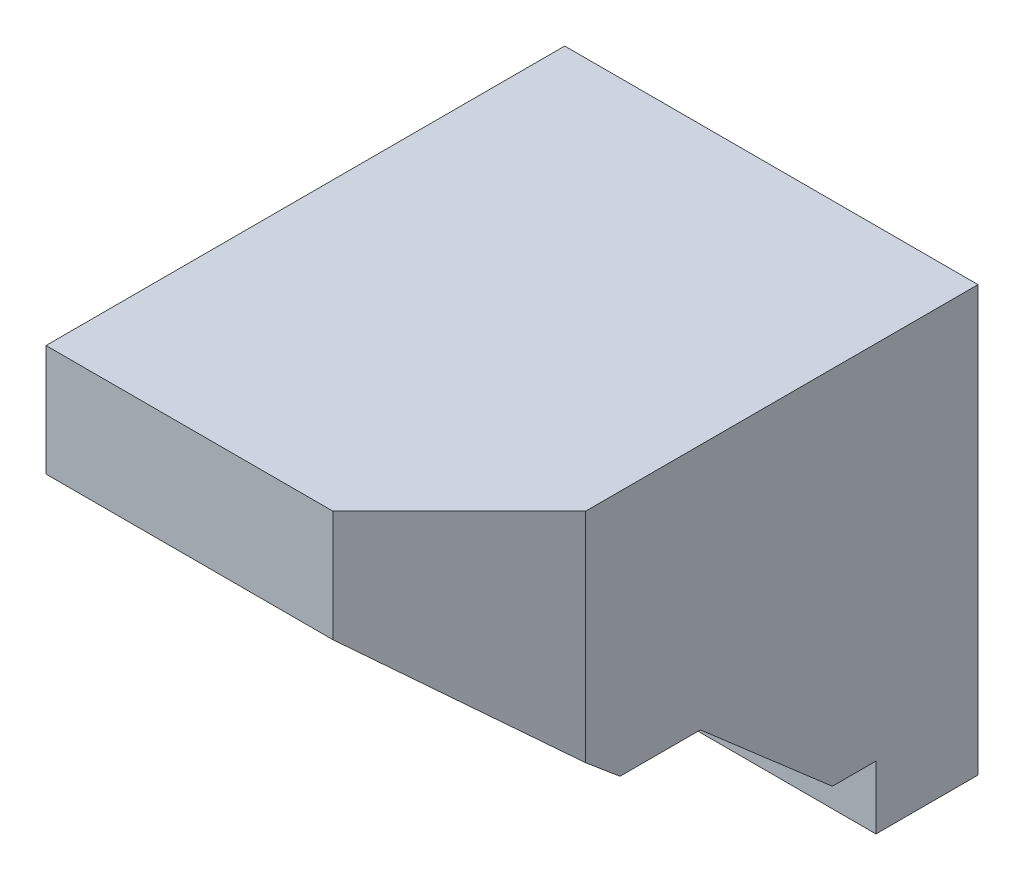
ISO-10303-21;
HEADER;
FILE_DESCRIPTION(('STEP AP214'),'2;1');
FILE_NAME('part.step','',(''),(''),'','','');
FILE_SCHEMA(('AUTOMOTIVE_DESIGN { 1 0 10303 214 1 1 1 1 }'));
ENDSEC;
DATA;
#1=APPLICATION_CONTEXT('core data for automotive mechanical design processes');
#2=APPLICATION_PROTOCOL_DEFINITION('international standard','automotive_design',2000,#1);
#3=PRODUCT_CONTEXT('',#1,'mechanical');
#4=PRODUCT('Part','Part','',(#3));
#5=PRODUCT_RELATED_PRODUCT_CATEGORY('part','',(#4));
#6=PRODUCT_DEFINITION_FORMATION('','',#4);
#7=PRODUCT_DEFINITION_CONTEXT('part definition',#1,'design');
#8=PRODUCT_DEFINITION('design','',#6,#7);
#9=PRODUCT_DEFINITION_SHAPE('','',#8);
#10=(LENGTH_UNIT() NAMED_UNIT(*) SI_UNIT(.MILLI.,.METRE.));
#11=(NAMED_UNIT(*) PLANE_ANGLE_UNIT() SI_UNIT($,.RADIAN.));
#12=(NAMED_UNIT(*) SI_UNIT($,.STERADIAN.) SOLID_ANGLE_UNIT());
#13=UNCERTAINTY_MEASURE_WITH_UNIT(LENGTH_MEASURE(1.E-05),#10,'distance_accuracy_value','');
#14=(GEOMETRIC_REPRESENTATION_CONTEXT(3) GLOBAL_UNCERTAINTY_ASSIGNED_CONTEXT((#13)) GLOBAL_UNIT_ASSIGNED_CONTEXT((#10,
#11,#12)) REPRESENTATION_CONTEXT('',''));
#15=CARTESIAN_POINT('',(0.,0.,0.));
#16=DIRECTION('',(0.,0.,1.));
#17=DIRECTION('',(1.,0.,0.));
#18=AXIS2_PLACEMENT_3D('',#15,#16,#17);
#19=CARTESIAN_POINT('',(180.,-292.,-311.875471025417));
#20=DIRECTION('',(0.,0.,-1.));
#21=DIRECTION('',(0.,1.,0.));
#22=AXIS2_PLACEMENT_3D('',#19,#20,#21);
#23=PLANE('',#22);
#24=DIRECTION('',(0.,1.,0.));
#25=VECTOR('',#24,1.);
#26=CARTESIAN_POINT('',(-180.,-199.5,-311.875471025417));
#27=LINE('',#26,#25);
#28=CARTESIAN_POINT('',(-179.999999999992,-477.,-311.875471025416));
#29=VERTEX_POINT('',#28);
#30=CARTESIAN_POINT('',(-179.999999999992,-107.,-311.875471025418));
#31=VERTEX_POINT('',#30);
#32=EDGE_CURVE('E11',#29,#31,#27,.T.);
#33=ORIENTED_EDGE('',*,*,#32,.T.);
#34=DIRECTION('',(-1.,0.,0.));
#35=VECTOR('',#34,1.);
#36=CARTESIAN_POINT('',(180.,-107.,-311.875471025418));
#37=LINE('',#36,#35);
#38=CARTESIAN_POINT('',(180.,-107.,-311.875471025418));
#39=VERTEX_POINT('',#38);
#40=EDGE_CURVE('E37',#39,#31,#37,.T.);
#41=ORIENTED_EDGE('',*,*,#40,.F.);
#42=DIRECTION('',(0.,-1.,0.));
#43=VECTOR('',#42,1.);
#44=CARTESIAN_POINT('',(180.,-107.,-311.875471025418));
#45=LINE('',#44,#43);
#46=CARTESIAN_POINT('',(180.,-477.,-311.875471025416));
#47=VERTEX_POINT('',#46);
#48=EDGE_CURVE('E28',#39,#47,#45,.T.);
#49=ORIENTED_EDGE('',*,*,#48,.T.);
#50=DIRECTION('',(-1.,0.,0.));
#51=VECTOR('',#50,1.);
#52=CARTESIAN_POINT('',(180.,-477.,-311.875471025416));
#53=LINE('',#52,#51);
#54=EDGE_CURVE('E155',#47,#29,#53,.T.);
#55=ORIENTED_EDGE('',*,*,#54,.T.);
#56=EDGE_LOOP('',(#33,#41,#49,#55));
#57=FACE_BOUND('',#56,.T.);
#58=ADVANCED_FACE('F17',(#57),#23,.T.);
#59=CARTESIAN_POINT('',(-180.,-422.,-204.000000000054));
#60=DIRECTION('',(0.,-1.,0.));
#61=DIRECTION('',(1.,0.,0.));
#62=AXIS2_PLACEMENT_3D('',#59,#60,#61);
#63=PLANE('',#62);
#64=DIRECTION('',(0.,0.,1.));
#65=VECTOR('',#64,1.);
#66=CARTESIAN_POINT('',(180.,-422.,-157.000000000026));
#67=LINE('',#66,#65);
#68=CARTESIAN_POINT('',(180.,-422.,-223.00000000006));
#69=VERTEX_POINT('',#68);
#70=CARTESIAN_POINT('',(180.,-422.,-185.000000000049));
#71=VERTEX_POINT('',#70);
#72=EDGE_CURVE('E159',#69,#71,#67,.T.);
#73=ORIENTED_EDGE('',*,*,#72,.T.);
#74=DIRECTION('',(-1.,0.,0.));
#75=VECTOR('',#74,1.);
#76=CARTESIAN_POINT('',(-180.,-422.,-185.000000000049));
#77=LINE('',#76,#75);
#78=CARTESIAN_POINT('',(-180.,-422.,-185.000000000049));
#79=VERTEX_POINT('',#78);
#80=EDGE_CURVE('E163',#71,#79,#77,.T.);
#81=ORIENTED_EDGE('',*,*,#80,.T.);
#82=DIRECTION('',(0.,0.,-1.));
#83=VECTOR('',#82,1.);
#84=CARTESIAN_POINT('',(-180.,-422.,-185.000000000049));
#85=LINE('',#84,#83);
#86=CARTESIAN_POINT('',(-180.,-422.,-223.00000000006));
#87=VERTEX_POINT('',#86);
#88=EDGE_CURVE('E167',#79,#87,#85,.T.);
#89=ORIENTED_EDGE('',*,*,#88,.T.);
#90=DIRECTION('',(-1.,0.,0.));
#91=VECTOR('',#90,1.);
#92=CARTESIAN_POINT('',(-180.,-422.,-223.00000000006));
#93=LINE('',#92,#91);
#94=EDGE_CURVE('E172',#69,#87,#93,.T.);
#95=ORIENTED_EDGE('',*,*,#94,.F.);
#96=EDGE_LOOP('',(#73,#81,#89,#95));
#97=FACE_BOUND('',#96,.T.);
#98=ADVANCED_FACE('F232',(#97),#63,.T.);
#99=CARTESIAN_POINT('',(-180.,-372.,-127.500000000049));
#100=DIRECTION('',(0.,-0.754605522163503,0.656178714924789));
#101=DIRECTION('',(1.,0.,0.));
#102=AXIS2_PLACEMENT_3D('',#99,#100,#101);
#103=PLANE('',#102);
#104=DIRECTION('',(0.,0.656178714924789,0.754605522163503));
#105=VECTOR('',#104,1.);
#106=CARTESIAN_POINT('',(180.,-310.616792249719,-56.9093110872253));
#107=LINE('',#106,#105);
#108=CARTESIAN_POINT('',(180.,-322.,-70.000000000049));
#109=VERTEX_POINT('',#108);
#110=EDGE_CURVE('E171',#71,#109,#107,.T.);
#111=ORIENTED_EDGE('',*,*,#110,.T.);
#112=DIRECTION('',(-1.,0.,0.));
#113=VECTOR('',#112,1.);
#114=CARTESIAN_POINT('',(-180.,-322.,-70.000000000049));
#115=LINE('',#114,#113);
#116=CARTESIAN_POINT('',(-180.,-322.,-70.0000000000489));
#117=VERTEX_POINT('',#116);
#118=EDGE_CURVE('E179',#109,#117,#115,.T.);
#119=ORIENTED_EDGE('',*,*,#118,.T.);
#120=DIRECTION('',(0.,-0.656178714924789,-0.754605522163503));
#121=VECTOR('',#120,1.);
#122=CARTESIAN_POINT('',(-180.,-322.,-70.0000000000489));
#123=LINE('',#122,#121);
#124=EDGE_CURVE('E183',#117,#79,#123,.T.);
#125=ORIENTED_EDGE('',*,*,#124,.T.);
#126=ORIENTED_EDGE('',*,*,#80,.F.);
#127=EDGE_LOOP('',(#111,#119,#125,#126));
#128=FACE_BOUND('',#127,.T.);
#129=ADVANCED_FACE('F234',(#128),#103,.T.);
#130=CARTESIAN_POINT('',(-180.,-322.,-35.0000000000239));
#131=DIRECTION('',(0.,-1.,0.));
#132=DIRECTION('',(1.,0.,0.));
#133=AXIS2_PLACEMENT_3D('',#130,#131,#132);
#134=PLANE('',#133);
#135=DIRECTION('',(0.,0.,1.));
#136=VECTOR('',#135,1.);
#137=CARTESIAN_POINT('',(180.,-322.,-72.5000000000114));
#138=LINE('',#137,#136);
#139=CARTESIAN_POINT('',(180.,-322.,1.0547118733939E-12));
#140=VERTEX_POINT('',#139);
#141=EDGE_CURVE('E187',#109,#140,#138,.T.);
#142=ORIENTED_EDGE('',*,*,#141,.T.);
#143=DIRECTION('',(-1.,0.,0.));
#144=VECTOR('',#143,1.);
#145=CARTESIAN_POINT('',(-180.,-322.,1.0547118733939E-12));
#146=LINE('',#145,#144);
#147=CARTESIAN_POINT('',(-180.,-322.,1.08246744900953E-12));
#148=VERTEX_POINT('',#147);
#149=EDGE_CURVE('E191',#140,#148,#146,.T.);
#150=ORIENTED_EDGE('',*,*,#149,.T.);
#151=DIRECTION('',(0.,0.,-1.));
#152=VECTOR('',#151,1.);
#153=CARTESIAN_POINT('',(-180.,-322.,1.08246744900953E-12));
#154=LINE('',#153,#152);
#155=EDGE_CURVE('E195',#148,#117,#154,.T.);
#156=ORIENTED_EDGE('',*,*,#155,.T.);
#157=ORIENTED_EDGE('',*,*,#118,.F.);
#158=EDGE_LOOP('',(#142,#150,#156,#157));
#159=FACE_BOUND('',#158,.T.);
#160=ADVANCED_FACE('F236',(#159),#134,.T.);
#161=CARTESIAN_POINT('',(-180.,-263.,70.0000000000009));
#162=DIRECTION('',(0.,-0.764627863081976,0.644472056026241));
#163=DIRECTION('',(1.,0.,0.));
#164=AXIS2_PLACEMENT_3D('',#161,#162,#163);
#165=PLANE('',#164);
#166=DIRECTION('',(-0.60741099872854,0.511960698928343,0.607410998728538));
#167=VECTOR('',#166,1.);
#168=CARTESIAN_POINT('',(51.1783751223552,-188.136059031699,158.821624877645));
#169=LINE('',#168,#167);
#170=CARTESIAN_POINT('',(180.,-296.714285714286,30.000000000001));
#171=VERTEX_POINT('',#170);
#172=CARTESIAN_POINT('',(70.,-204.,140.));
#173=VERTEX_POINT('',#172);
#174=EDGE_CURVE('E114',#171,#173,#169,.T.);
#175=ORIENTED_EDGE('',*,*,#174,.T.);
#176=DIRECTION('',(-1.,0.,0.));
#177=VECTOR('',#176,1.);
#178=CARTESIAN_POINT('',(-117.5,-204.,140.));
#179=LINE('',#178,#177);
#180=CARTESIAN_POINT('',(-180.,-204.,140.));
#181=VERTEX_POINT('',#180);
#182=EDGE_CURVE('E201',#173,#181,#179,.T.);
#183=ORIENTED_EDGE('',*,*,#182,.T.);
#184=DIRECTION('',(0.,-0.644472056026241,-0.764627863081976));
#185=VECTOR('',#184,1.);
#186=CARTESIAN_POINT('',(-180.,-204.,140.));
#187=LINE('',#186,#185);
#188=EDGE_CURVE('E205',#181,#148,#187,.T.);
#189=ORIENTED_EDGE('',*,*,#188,.T.);
#190=ORIENTED_EDGE('',*,*,#149,.F.);
#191=DIRECTION('',(0.,0.644472056026241,0.764627863081976));
#192=VECTOR('',#191,1.);
#193=CARTESIAN_POINT('',(180.,-274.953466173488,55.8179214890834));
#194=LINE('',#193,#192);
#195=EDGE_CURVE('E209',#140,#171,#194,.T.);
#196=ORIENTED_EDGE('',*,*,#195,.T.);
#197=EDGE_LOOP('',(#175,#183,#189,#190,#196));
#198=FACE_BOUND('',#197,.T.);
#199=ADVANCED_FACE('F238',(#198),#165,.T.);
#200=CARTESIAN_POINT('',(-180.,-449.5,-223.000000000059));
#201=DIRECTION('',(0.,0.,1.));
#202=DIRECTION('',(-1.,0.,0.));
#203=AXIS2_PLACEMENT_3D('',#200,#201,#202);
#204=PLANE('',#203);
#205=DIRECTION('',(0.,1.,0.));
#206=VECTOR('',#205,1.);
#207=CARTESIAN_POINT('',(180.,-278.25,-223.00000000006));
#208=LINE('',#207,#206);
#209=CARTESIAN_POINT('',(180.,-477.,-223.000000000059));
#210=VERTEX_POINT('',#209);
#211=EDGE_CURVE('E175',#210,#69,#208,.T.);
#212=ORIENTED_EDGE('',*,*,#211,.T.);
#213=ORIENTED_EDGE('',*,*,#94,.T.);
#214=DIRECTION('',(0.,-1.,0.));
#215=VECTOR('',#214,1.);
#216=CARTESIAN_POINT('',(-180.,-422.,-223.00000000006));
#217=LINE('',#216,#215);
#218=CARTESIAN_POINT('',(-180.,-477.,-223.000000000059));
#219=VERTEX_POINT('',#218);
#220=EDGE_CURVE('E136',#87,#219,#217,.T.);
#221=ORIENTED_EDGE('',*,*,#220,.T.);
#222=DIRECTION('',(-1.,0.,0.));
#223=VECTOR('',#222,1.);
#224=CARTESIAN_POINT('',(-90.,-477.,-223.000000000059));
#225=LINE('',#224,#223);
#226=EDGE_CURVE('E128',#210,#219,#225,.T.);
#227=ORIENTED_EDGE('',*,*,#226,.F.);
#228=EDGE_LOOP('',(#212,#213,#221,#227));
#229=FACE_BOUND('',#228,.T.);
#230=ADVANCED_FACE('F220',(#229),#204,.T.);
#231=CARTESIAN_POINT('',(-55.,-107.,140.));
#232=DIRECTION('',(0.,0.,1.));
#233=DIRECTION('',(-1.,0.,0.));
#234=AXIS2_PLACEMENT_3D('',#231,#232,#233);
#235=PLANE('',#234);
#236=ORIENTED_EDGE('',*,*,#182,.F.);
#237=DIRECTION('',(0.,-1.,0.));
#238=VECTOR('',#237,1.);
#239=CARTESIAN_POINT('',(70.,-107.,140.));
#240=LINE('',#239,#238);
#241=CARTESIAN_POINT('',(70.,-107.,140.));
#242=VERTEX_POINT('',#241);
#243=EDGE_CURVE('E117',#242,#173,#240,.T.);
#244=ORIENTED_EDGE('',*,*,#243,.F.);
#245=DIRECTION('',(1.,0.,0.));
#246=VECTOR('',#245,1.);
#247=CARTESIAN_POINT('',(-180.,-107.,140.));
#248=LINE('',#247,#246);
#249=CARTESIAN_POINT('',(-180.,-107.,140.));
#250=VERTEX_POINT('',#249);
#251=EDGE_CURVE('E91',#250,#242,#248,.T.);
#252=ORIENTED_EDGE('',*,*,#251,.F.);
#253=DIRECTION('',(0.,-1.,0.));
#254=VECTOR('',#253,1.);
#255=CARTESIAN_POINT('',(-180.,-107.,140.));
#256=LINE('',#255,#254);
#257=EDGE_CURVE('E133',#250,#181,#256,.T.);
#258=ORIENTED_EDGE('',*,*,#257,.T.);
#259=EDGE_LOOP('',(#236,#244,#252,#258));
#260=FACE_BOUND('',#259,.T.);
#261=ADVANCED_FACE('F239',(#260),#235,.T.);
#262=CARTESIAN_POINT('',(0.,-477.,1.66422298576545E-12));
#263=DIRECTION('',(0.,-1.,0.));
#264=DIRECTION('',(1.,0.,0.));
#265=AXIS2_PLACEMENT_3D('',#262,#263,#264);
#266=PLANE('',#265);
#267=DIRECTION('',(0.,0.,1.));
#268=VECTOR('',#267,1.);
#269=CARTESIAN_POINT('',(180.,-477.,-311.875471025416));
#270=LINE('',#269,#268);
#271=EDGE_CURVE('E137',#47,#210,#270,.T.);
#272=ORIENTED_EDGE('',*,*,#271,.T.);
#273=ORIENTED_EDGE('',*,*,#226,.T.);
#274=DIRECTION('',(0.,0.,1.));
#275=VECTOR('',#274,1.);
#276=CARTESIAN_POINT('',(-180.,-477.,-250.));
#277=LINE('',#276,#275);
#278=EDGE_CURVE('E116',#29,#219,#277,.T.);
#279=ORIENTED_EDGE('',*,*,#278,.F.);
#280=ORIENTED_EDGE('',*,*,#54,.F.);
#281=EDGE_LOOP('',(#272,#273,#279,#280));
#282=FACE_BOUND('',#281,.T.);
#283=ADVANCED_FACE('F227',(#282),#266,.T.);
#284=CARTESIAN_POINT('',(-180.,-107.,-55.));
#285=DIRECTION('',(-1.,0.,0.));
#286=DIRECTION('',(0.,0.,-1.));
#287=AXIS2_PLACEMENT_3D('',#284,#285,#286);
#288=PLANE('',#287);
#289=ORIENTED_EDGE('',*,*,#220,.F.);
#290=ORIENTED_EDGE('',*,*,#88,.F.);
#291=ORIENTED_EDGE('',*,*,#124,.F.);
#292=ORIENTED_EDGE('',*,*,#155,.F.);
#293=ORIENTED_EDGE('',*,*,#188,.F.);
#294=ORIENTED_EDGE('',*,*,#257,.F.);
#295=DIRECTION('',(0.,0.,1.));
#296=VECTOR('',#295,1.);
#297=CARTESIAN_POINT('',(-180.,-107.,-250.));
#298=LINE('',#297,#296);
#299=EDGE_CURVE('E132',#31,#250,#298,.T.);
#300=ORIENTED_EDGE('',*,*,#299,.F.);
#301=ORIENTED_EDGE('',*,*,#32,.F.);
#302=ORIENTED_EDGE('',*,*,#278,.T.);
#303=EDGE_LOOP('',(#289,#290,#291,#292,#293,#294,#300,#301,#302));
#304=FACE_BOUND('',#303,.T.);
#305=ADVANCED_FACE('F225',(#304),#288,.T.);
#306=CARTESIAN_POINT('',(180.,-107.,-110.));
#307=DIRECTION('',(1.,0.,0.));
#308=DIRECTION('',(0.,-1.,0.));
#309=AXIS2_PLACEMENT_3D('',#306,#307,#308);
#310=PLANE('',#309);
#311=ORIENTED_EDGE('',*,*,#72,.F.);
#312=ORIENTED_EDGE('',*,*,#211,.F.);
#313=ORIENTED_EDGE('',*,*,#271,.F.);
#314=ORIENTED_EDGE('',*,*,#48,.F.);
#315=DIRECTION('',(0.,0.,-1.));
#316=VECTOR('',#315,1.);
#317=CARTESIAN_POINT('',(180.,-107.,-250.));
#318=LINE('',#317,#316);
#319=CARTESIAN_POINT('',(180.,-107.,30.));
#320=VERTEX_POINT('',#319);
#321=EDGE_CURVE('E97',#320,#39,#318,.T.);
#322=ORIENTED_EDGE('',*,*,#321,.F.);
#323=DIRECTION('',(0.,-1.,0.));
#324=VECTOR('',#323,1.);
#325=CARTESIAN_POINT('',(180.,-107.,30.));
#326=LINE('',#325,#324);
#327=EDGE_CURVE('E102',#320,#171,#326,.T.);
#328=ORIENTED_EDGE('',*,*,#327,.T.);
#329=ORIENTED_EDGE('',*,*,#195,.F.);
#330=ORIENTED_EDGE('',*,*,#141,.F.);
#331=ORIENTED_EDGE('',*,*,#110,.F.);
#332=EDGE_LOOP('',(#311,#312,#313,#314,#322,#328,#329,#330,#331));
#333=FACE_BOUND('',#332,.T.);
#334=ADVANCED_FACE('F100',(#333),#310,.T.);
#335=CARTESIAN_POINT('',(125.,-107.,85.));
#336=DIRECTION('',(0.707106781186548,0.,0.707106781186547));
#337=DIRECTION('',(0.,1.,0.));
#338=AXIS2_PLACEMENT_3D('',#335,#336,#337);
#339=PLANE('',#338);
#340=ORIENTED_EDGE('',*,*,#174,.F.);
#341=ORIENTED_EDGE('',*,*,#327,.F.);
#342=DIRECTION('',(0.707106781186547,0.,-0.707106781186548));
#343=VECTOR('',#342,1.);
#344=CARTESIAN_POINT('',(70.,-107.,140.));
#345=LINE('',#344,#343);
#346=EDGE_CURVE('E21',#242,#320,#345,.T.);
#347=ORIENTED_EDGE('',*,*,#346,.F.);
#348=ORIENTED_EDGE('',*,*,#243,.T.);
#349=EDGE_LOOP('',(#340,#341,#347,#348));
#350=FACE_BOUND('',#349,.T.);
#351=ADVANCED_FACE('F111',(#350),#339,.T.);
#352=CARTESIAN_POINT('',(0.,-107.,3.73588719638704E-13));
#353=DIRECTION('',(0.,-1.,0.));
#354=DIRECTION('',(1.,0.,0.));
#355=AXIS2_PLACEMENT_3D('',#352,#353,#354);
#356=PLANE('',#355);
#357=ORIENTED_EDGE('',*,*,#346,.T.);
#358=ORIENTED_EDGE('',*,*,#321,.T.);
#359=ORIENTED_EDGE('',*,*,#40,.T.);
#360=ORIENTED_EDGE('',*,*,#299,.T.);
#361=ORIENTED_EDGE('',*,*,#251,.T.);
#362=EDGE_LOOP('',(#357,#358,#359,#360,#361));
#363=FACE_BOUND('',#362,.T.);
#364=ADVANCED_FACE('F19',(#363),#356,.F.);
#365=CLOSED_SHELL('',(#58,#98,#129,#160,#199,#230,#261,#283,#305,#334,#351,#364));
#366=MANIFOLD_SOLID_BREP('B1',#365);
#367=ADVANCED_BREP_SHAPE_REPRESENTATION('',(#18,#366),#14);
#368=SHAPE_DEFINITION_REPRESENTATION(#9,#367);
ENDSEC;
END-ISO-10303-21;
